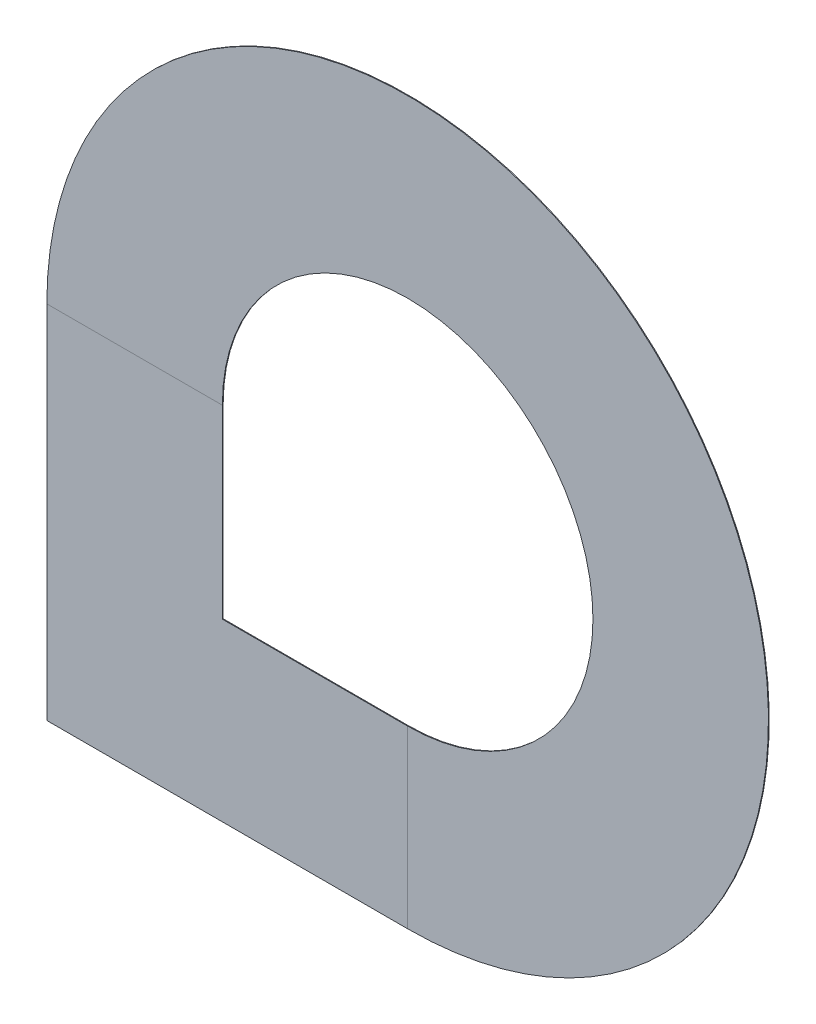
ISO-10303-21;
HEADER;
FILE_DESCRIPTION(('STEP AP214'),'2;1');
FILE_NAME('part.step','',(''),(''),'','','');
FILE_SCHEMA(('AUTOMOTIVE_DESIGN { 1 0 10303 214 1 1 1 1 }'));
ENDSEC;
DATA;
#1=APPLICATION_CONTEXT('core data for automotive mechanical design processes');
#2=APPLICATION_PROTOCOL_DEFINITION('international standard','automotive_design',2000,#1);
#3=PRODUCT_CONTEXT('',#1,'mechanical');
#4=PRODUCT('Part','Part','',(#3));
#5=PRODUCT_RELATED_PRODUCT_CATEGORY('part','',(#4));
#6=PRODUCT_DEFINITION_FORMATION('','',#4);
#7=PRODUCT_DEFINITION_CONTEXT('part definition',#1,'design');
#8=PRODUCT_DEFINITION('design','',#6,#7);
#9=PRODUCT_DEFINITION_SHAPE('','',#8);
#10=(LENGTH_UNIT() NAMED_UNIT(*) SI_UNIT(.MILLI.,.METRE.));
#11=(NAMED_UNIT(*) PLANE_ANGLE_UNIT() SI_UNIT($,.RADIAN.));
#12=(NAMED_UNIT(*) SI_UNIT($,.STERADIAN.) SOLID_ANGLE_UNIT());
#13=UNCERTAINTY_MEASURE_WITH_UNIT(LENGTH_MEASURE(1.E-05),#10,'distance_accuracy_value','');
#14=(GEOMETRIC_REPRESENTATION_CONTEXT(3) GLOBAL_UNCERTAINTY_ASSIGNED_CONTEXT((#13)) GLOBAL_UNIT_ASSIGNED_CONTEXT((#10,
#11,#12)) REPRESENTATION_CONTEXT('',''));
#15=CARTESIAN_POINT('',(0.,0.,0.));
#16=DIRECTION('',(0.,0.,1.));
#17=DIRECTION('',(1.,0.,0.));
#18=AXIS2_PLACEMENT_3D('',#15,#16,#17);
#19=CARTESIAN_POINT('',(-225.,-247.6,-1.));
#20=DIRECTION('',(0.,0.,-1.));
#21=DIRECTION('',(-1.,0.,0.));
#22=AXIS2_PLACEMENT_3D('',#19,#20,#21);
#23=PLANE('',#22);
#24=DIRECTION('',(0.,1.,0.));
#25=VECTOR('',#24,1.);
#26=CARTESIAN_POINT('',(225.,-247.6,-1.));
#27=LINE('',#26,#25);
#28=CARTESIAN_POINT('',(225.,225.,-1.));
#29=VERTEX_POINT('',#28);
#30=CARTESIAN_POINT('',(225.,700.,-1.));
#31=VERTEX_POINT('',#30);
#32=EDGE_CURVE('E139',#29,#31,#27,.T.);
#33=ORIENTED_EDGE('',*,*,#32,.F.);
#34=DIRECTION('',(-1.,0.,0.));
#35=VECTOR('',#34,1.);
#36=CARTESIAN_POINT('',(700.,225.,-1.));
#37=LINE('',#36,#35);
#38=CARTESIAN_POINT('',(700.,225.,-1.));
#39=VERTEX_POINT('',#38);
#40=EDGE_CURVE('E118',#39,#29,#37,.T.);
#41=ORIENTED_EDGE('',*,*,#40,.F.);
#42=DIRECTION('',(0.,-1.,0.));
#43=VECTOR('',#42,1.);
#44=CARTESIAN_POINT('',(700.,-225.,-1.));
#45=LINE('',#44,#43);
#46=CARTESIAN_POINT('',(700.,-225.,-1.));
#47=VERTEX_POINT('',#46);
#48=EDGE_CURVE('E107',#39,#47,#45,.T.);
#49=ORIENTED_EDGE('',*,*,#48,.T.);
#50=DIRECTION('',(-1.,0.,0.));
#51=VECTOR('',#50,1.);
#52=CARTESIAN_POINT('',(700.,-225.,-1.));
#53=LINE('',#52,#51);
#54=CARTESIAN_POINT('',(-225.,-225.,-1.));
#55=VERTEX_POINT('',#54);
#56=EDGE_CURVE('E97',#47,#55,#53,.T.);
#57=ORIENTED_EDGE('',*,*,#56,.T.);
#58=DIRECTION('',(0.,1.,0.));
#59=VECTOR('',#58,1.);
#60=CARTESIAN_POINT('',(-225.,-247.6,-1.));
#61=LINE('',#60,#59);
#62=CARTESIAN_POINT('',(-225.,700.,-1.));
#63=VERTEX_POINT('',#62);
#64=EDGE_CURVE('E11',#55,#63,#61,.T.);
#65=ORIENTED_EDGE('',*,*,#64,.T.);
#66=DIRECTION('',(-1.,0.,0.));
#67=VECTOR('',#66,1.);
#68=CARTESIAN_POINT('',(-225.,700.,-1.));
#69=LINE('',#68,#67);
#70=EDGE_CURVE('E122',#31,#63,#69,.T.);
#71=ORIENTED_EDGE('',*,*,#70,.F.);
#72=EDGE_LOOP('',(#33,#41,#49,#57,#65,#71));
#73=FACE_BOUND('',#72,.T.);
#74=ADVANCED_FACE('F39',(#73),#23,.T.);
#75=CARTESIAN_POINT('',(225.,-247.6,-1.));
#76=DIRECTION('',(1.,0.,0.));
#77=DIRECTION('',(0.,1.,0.));
#78=AXIS2_PLACEMENT_3D('',#75,#76,#77);
#79=PLANE('',#78);
#80=DIRECTION('',(0.,0.,1.));
#81=VECTOR('',#80,1.);
#82=CARTESIAN_POINT('',(225.,225.,-1.));
#83=LINE('',#82,#81);
#84=CARTESIAN_POINT('',(225.,225.,1.));
#85=VERTEX_POINT('',#84);
#86=EDGE_CURVE('E102',#29,#85,#83,.T.);
#87=ORIENTED_EDGE('',*,*,#86,.F.);
#88=ORIENTED_EDGE('',*,*,#32,.T.);
#89=DIRECTION('',(0.,0.,-1.));
#90=VECTOR('',#89,1.);
#91=CARTESIAN_POINT('',(225.,700.,-1.));
#92=LINE('',#91,#90);
#93=CARTESIAN_POINT('',(225.,700.,1.));
#94=VERTEX_POINT('',#93);
#95=EDGE_CURVE('E125',#94,#31,#92,.T.);
#96=ORIENTED_EDGE('',*,*,#95,.F.);
#97=DIRECTION('',(0.,1.,0.));
#98=VECTOR('',#97,1.);
#99=CARTESIAN_POINT('',(225.,-247.6,1.));
#100=LINE('',#99,#98);
#101=EDGE_CURVE('E141',#85,#94,#100,.T.);
#102=ORIENTED_EDGE('',*,*,#101,.F.);
#103=EDGE_LOOP('',(#87,#88,#96,#102));
#104=FACE_BOUND('',#103,.T.);
#105=ADVANCED_FACE('F157',(#104),#79,.T.);
#106=CARTESIAN_POINT('',(-225.,-247.6,1.));
#107=DIRECTION('',(0.,0.,1.));
#108=DIRECTION('',(1.,0.,0.));
#109=AXIS2_PLACEMENT_3D('',#106,#107,#108);
#110=PLANE('',#109);
#111=DIRECTION('',(0.,1.,0.));
#112=VECTOR('',#111,1.);
#113=CARTESIAN_POINT('',(-225.,-247.6,1.));
#114=LINE('',#113,#112);
#115=CARTESIAN_POINT('',(-225.,-225.,1.));
#116=VERTEX_POINT('',#115);
#117=CARTESIAN_POINT('',(-225.,700.,1.));
#118=VERTEX_POINT('',#117);
#119=EDGE_CURVE('E46',#116,#118,#114,.T.);
#120=ORIENTED_EDGE('',*,*,#119,.F.);
#121=DIRECTION('',(-1.,0.,0.));
#122=VECTOR('',#121,1.);
#123=CARTESIAN_POINT('',(700.,-225.,1.));
#124=LINE('',#123,#122);
#125=CARTESIAN_POINT('',(700.,-225.,1.));
#126=VERTEX_POINT('',#125);
#127=EDGE_CURVE('E100',#126,#116,#124,.T.);
#128=ORIENTED_EDGE('',*,*,#127,.F.);
#129=DIRECTION('',(0.,1.,0.));
#130=VECTOR('',#129,1.);
#131=CARTESIAN_POINT('',(700.,-225.,1.));
#132=LINE('',#131,#130);
#133=CARTESIAN_POINT('',(700.,225.,1.));
#134=VERTEX_POINT('',#133);
#135=EDGE_CURVE('E160',#126,#134,#132,.T.);
#136=ORIENTED_EDGE('',*,*,#135,.T.);
#137=DIRECTION('',(-1.,0.,0.));
#138=VECTOR('',#137,1.);
#139=CARTESIAN_POINT('',(700.,225.,1.));
#140=LINE('',#139,#138);
#141=EDGE_CURVE('E110',#134,#85,#140,.T.);
#142=ORIENTED_EDGE('',*,*,#141,.T.);
#143=ORIENTED_EDGE('',*,*,#101,.T.);
#144=DIRECTION('',(1.,0.,0.));
#145=VECTOR('',#144,1.);
#146=CARTESIAN_POINT('',(-225.,700.,1.));
#147=LINE('',#146,#145);
#148=EDGE_CURVE('E131',#118,#94,#147,.T.);
#149=ORIENTED_EDGE('',*,*,#148,.F.);
#150=EDGE_LOOP('',(#120,#128,#136,#142,#143,#149));
#151=FACE_BOUND('',#150,.T.);
#152=ADVANCED_FACE('F145',(#151),#110,.T.);
#153=CARTESIAN_POINT('',(-225.,-247.6,-1.));
#154=DIRECTION('',(-1.,0.,0.));
#155=DIRECTION('',(0.,-1.,0.));
#156=AXIS2_PLACEMENT_3D('',#153,#154,#155);
#157=PLANE('',#156);
#158=DIRECTION('',(0.,0.,-1.));
#159=VECTOR('',#158,1.);
#160=CARTESIAN_POINT('',(-225.,-225.,-1.));
#161=LINE('',#160,#159);
#162=EDGE_CURVE('E89',#116,#55,#161,.T.);
#163=ORIENTED_EDGE('',*,*,#162,.F.);
#164=ORIENTED_EDGE('',*,*,#119,.T.);
#165=DIRECTION('',(0.,0.,1.));
#166=VECTOR('',#165,1.);
#167=CARTESIAN_POINT('',(-225.,700.,-1.));
#168=LINE('',#167,#166);
#169=EDGE_CURVE('E91',#63,#118,#168,.T.);
#170=ORIENTED_EDGE('',*,*,#169,.F.);
#171=ORIENTED_EDGE('',*,*,#64,.F.);
#172=EDGE_LOOP('',(#163,#164,#170,#171));
#173=FACE_BOUND('',#172,.T.);
#174=ADVANCED_FACE('F88',(#173),#157,.T.);
#175=CARTESIAN_POINT('',(700.,700.,0.));
#176=DIRECTION('',(0.,0.,-1.));
#177=DIRECTION('',(-1.,0.,0.));
#178=AXIS2_PLACEMENT_3D('',#175,#176,#177);
#179=CYLINDRICAL_SURFACE('',#178,925.);
#180=CARTESIAN_POINT('',(700.,700.,1.));
#181=DIRECTION('',(0.,0.,-1.));
#182=DIRECTION('',(-1.,0.,0.));
#183=AXIS2_PLACEMENT_3D('',#180,#181,#182);
#184=CIRCLE('',#183,925.);
#185=EDGE_CURVE('E133',#118,#126,#184,.T.);
#186=ORIENTED_EDGE('',*,*,#185,.T.);
#187=DIRECTION('',(0.,0.,1.));
#188=VECTOR('',#187,1.);
#189=CARTESIAN_POINT('',(700.,-225.,-1.));
#190=LINE('',#189,#188);
#191=EDGE_CURVE('E101',#47,#126,#190,.T.);
#192=ORIENTED_EDGE('',*,*,#191,.F.);
#193=CARTESIAN_POINT('',(700.,700.,-1.));
#194=DIRECTION('',(0.,0.,-1.));
#195=DIRECTION('',(-1.,0.,0.));
#196=AXIS2_PLACEMENT_3D('',#193,#194,#195);
#197=CIRCLE('',#196,925.);
#198=EDGE_CURVE('E126',#63,#47,#197,.T.);
#199=ORIENTED_EDGE('',*,*,#198,.F.);
#200=ORIENTED_EDGE('',*,*,#169,.T.);
#201=EDGE_LOOP('',(#186,#192,#199,#200));
#202=FACE_BOUND('',#201,.T.);
#203=ADVANCED_FACE('F162',(#202),#179,.T.);
#204=CARTESIAN_POINT('',(-225.,700.,1.));
#205=DIRECTION('',(0.,0.,1.));
#206=DIRECTION('',(1.,0.,0.));
#207=AXIS2_PLACEMENT_3D('',#204,#205,#206);
#208=PLANE('',#207);
#209=CARTESIAN_POINT('',(700.,700.,1.));
#210=DIRECTION('',(0.,0.,-1.));
#211=DIRECTION('',(-1.,0.,0.));
#212=AXIS2_PLACEMENT_3D('',#209,#210,#211);
#213=CIRCLE('',#212,475.);
#214=EDGE_CURVE('E128',#94,#134,#213,.T.);
#215=ORIENTED_EDGE('',*,*,#214,.T.);
#216=ORIENTED_EDGE('',*,*,#135,.F.);
#217=ORIENTED_EDGE('',*,*,#185,.F.);
#218=ORIENTED_EDGE('',*,*,#148,.T.);
#219=EDGE_LOOP('',(#215,#216,#217,#218));
#220=FACE_BOUND('',#219,.T.);
#221=ADVANCED_FACE('F159',(#220),#208,.T.);
#222=CARTESIAN_POINT('',(700.,700.,0.));
#223=DIRECTION('',(0.,0.,-1.));
#224=DIRECTION('',(-1.,0.,0.));
#225=AXIS2_PLACEMENT_3D('',#222,#223,#224);
#226=CYLINDRICAL_SURFACE('',#225,475.);
#227=CARTESIAN_POINT('',(700.,700.,-1.));
#228=DIRECTION('',(0.,0.,-1.));
#229=DIRECTION('',(-1.,0.,0.));
#230=AXIS2_PLACEMENT_3D('',#227,#228,#229);
#231=CIRCLE('',#230,475.);
#232=EDGE_CURVE('E121',#31,#39,#231,.T.);
#233=ORIENTED_EDGE('',*,*,#232,.T.);
#234=DIRECTION('',(0.,0.,-1.));
#235=VECTOR('',#234,1.);
#236=CARTESIAN_POINT('',(700.,225.,-1.));
#237=LINE('',#236,#235);
#238=EDGE_CURVE('E112',#134,#39,#237,.T.);
#239=ORIENTED_EDGE('',*,*,#238,.F.);
#240=ORIENTED_EDGE('',*,*,#214,.F.);
#241=ORIENTED_EDGE('',*,*,#95,.T.);
#242=EDGE_LOOP('',(#233,#239,#240,#241));
#243=FACE_BOUND('',#242,.T.);
#244=ADVANCED_FACE('F153',(#243),#226,.F.);
#245=CARTESIAN_POINT('',(-225.,700.,-1.));
#246=DIRECTION('',(0.,0.,-1.));
#247=DIRECTION('',(-1.,0.,0.));
#248=AXIS2_PLACEMENT_3D('',#245,#246,#247);
#249=PLANE('',#248);
#250=ORIENTED_EDGE('',*,*,#198,.T.);
#251=ORIENTED_EDGE('',*,*,#48,.F.);
#252=ORIENTED_EDGE('',*,*,#232,.F.);
#253=ORIENTED_EDGE('',*,*,#70,.T.);
#254=EDGE_LOOP('',(#250,#251,#252,#253));
#255=FACE_BOUND('',#254,.T.);
#256=ADVANCED_FACE('F169',(#255),#249,.T.);
#257=CARTESIAN_POINT('',(700.,225.,-1.));
#258=DIRECTION('',(0.,1.,0.));
#259=DIRECTION('',(-1.,0.,0.));
#260=AXIS2_PLACEMENT_3D('',#257,#258,#259);
#261=PLANE('',#260);
#262=ORIENTED_EDGE('',*,*,#40,.T.);
#263=ORIENTED_EDGE('',*,*,#86,.T.);
#264=ORIENTED_EDGE('',*,*,#141,.F.);
#265=ORIENTED_EDGE('',*,*,#238,.T.);
#266=EDGE_LOOP('',(#262,#263,#264,#265));
#267=FACE_BOUND('',#266,.T.);
#268=ADVANCED_FACE('F167',(#267),#261,.T.);
#269=CARTESIAN_POINT('',(700.,-225.,-1.));
#270=DIRECTION('',(0.,-1.,0.));
#271=DIRECTION('',(1.,0.,0.));
#272=AXIS2_PLACEMENT_3D('',#269,#270,#271);
#273=PLANE('',#272);
#274=ORIENTED_EDGE('',*,*,#127,.T.);
#275=ORIENTED_EDGE('',*,*,#162,.T.);
#276=ORIENTED_EDGE('',*,*,#56,.F.);
#277=ORIENTED_EDGE('',*,*,#191,.T.);
#278=EDGE_LOOP('',(#274,#275,#276,#277));
#279=FACE_BOUND('',#278,.T.);
#280=ADVANCED_FACE('F95',(#279),#273,.T.);
#281=CLOSED_SHELL('',(#74,#105,#152,#174,#203,#221,#244,#256,#268,#280));
#282=MANIFOLD_SOLID_BREP('B2',#281);
#283=ADVANCED_BREP_SHAPE_REPRESENTATION('',(#18,#282),#14);
#284=SHAPE_DEFINITION_REPRESENTATION(#9,#283);
ENDSEC;
END-ISO-10303-21;
